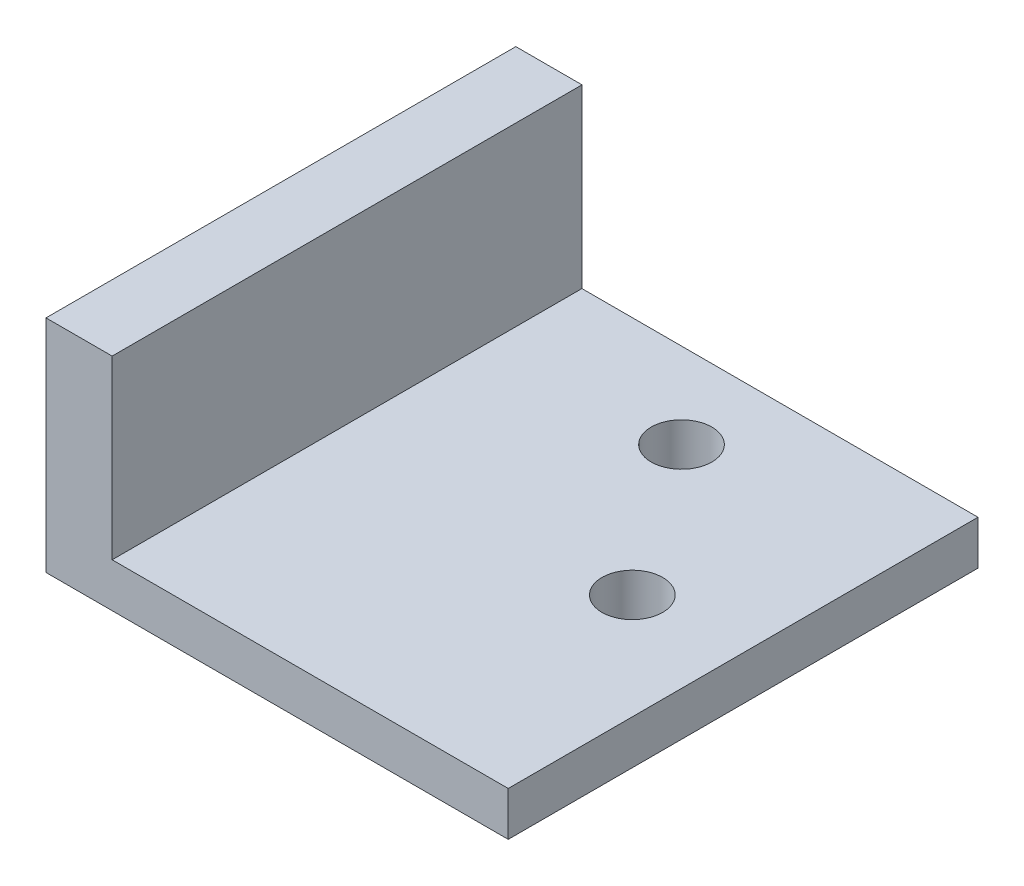
ISO-10303-21;
HEADER;
FILE_DESCRIPTION(('STEP AP214'),'2;1');
FILE_NAME('part.step','',(''),(''),'','','');
FILE_SCHEMA(('AUTOMOTIVE_DESIGN { 1 0 10303 214 1 1 1 1 }'));
ENDSEC;
DATA;
#1=APPLICATION_CONTEXT('core data for automotive mechanical design processes');
#2=APPLICATION_PROTOCOL_DEFINITION('international standard','automotive_design',2000,#1);
#3=PRODUCT_CONTEXT('',#1,'mechanical');
#4=PRODUCT('Part','Part','',(#3));
#5=PRODUCT_RELATED_PRODUCT_CATEGORY('part','',(#4));
#6=PRODUCT_DEFINITION_FORMATION('','',#4);
#7=PRODUCT_DEFINITION_CONTEXT('part definition',#1,'design');
#8=PRODUCT_DEFINITION('design','',#6,#7);
#9=PRODUCT_DEFINITION_SHAPE('','',#8);
#10=(LENGTH_UNIT() NAMED_UNIT(*) SI_UNIT(.MILLI.,.METRE.));
#11=(NAMED_UNIT(*) PLANE_ANGLE_UNIT() SI_UNIT($,.RADIAN.));
#12=(NAMED_UNIT(*) SI_UNIT($,.STERADIAN.) SOLID_ANGLE_UNIT());
#13=UNCERTAINTY_MEASURE_WITH_UNIT(LENGTH_MEASURE(1.E-05),#10,'distance_accuracy_value','');
#14=(GEOMETRIC_REPRESENTATION_CONTEXT(3) GLOBAL_UNCERTAINTY_ASSIGNED_CONTEXT((#13)) GLOBAL_UNIT_ASSIGNED_CONTEXT((#10,
#11,#12)) REPRESENTATION_CONTEXT('',''));
#15=CARTESIAN_POINT('',(0.,0.,0.));
#16=DIRECTION('',(0.,0.,1.));
#17=DIRECTION('',(1.,0.,0.));
#18=AXIS2_PLACEMENT_3D('',#15,#16,#17);
#19=CARTESIAN_POINT('',(0.,2.,0.));
#20=DIRECTION('',(0.,1.,0.));
#21=DIRECTION('',(0.,0.,1.));
#22=AXIS2_PLACEMENT_3D('',#19,#20,#21);
#23=PLANE('',#22);
#24=CARTESIAN_POINT('',(-2.59702508605739,2.,-12.1152087906646));
#25=DIRECTION('',(0.,1.,0.));
#26=DIRECTION('',(0.,0.,1.));
#27=AXIS2_PLACEMENT_3D('',#24,#25,#26);
#28=CIRCLE('',#27,1.375);
#29=CARTESIAN_POINT('',(-2.59702508605739,2.,-10.7402087906646));
#30=VERTEX_POINT('',#29);
#31=EDGE_CURVE('E158',#30,#30,#28,.T.);
#32=ORIENTED_EDGE('',*,*,#31,.F.);
#33=EDGE_LOOP('',(#32));
#34=FACE_BOUND('',#33,.T.);
#35=DIRECTION('',(-1.,0.,0.));
#36=VECTOR('',#35,1.);
#37=CARTESIAN_POINT('',(6.97994089204036,2.,-15.9817188738401));
#38=LINE('',#37,#36);
#39=CARTESIAN_POINT('',(6.97994089204036,2.,-15.9817188738401));
#40=VERTEX_POINT('',#39);
#41=CARTESIAN_POINT('',(-10.9799408920404,2.,-15.9817188738401));
#42=VERTEX_POINT('',#41);
#43=EDGE_CURVE('E170',#40,#42,#38,.T.);
#44=ORIENTED_EDGE('',*,*,#43,.T.);
#45=DIRECTION('',(0.,0.,1.));
#46=VECTOR('',#45,1.);
#47=CARTESIAN_POINT('',(-10.9799408920404,2.,-15.9817188738401));
#48=LINE('',#47,#46);
#49=CARTESIAN_POINT('',(-10.9799408920404,2.,5.32048414468573));
#50=VERTEX_POINT('',#49);
#51=EDGE_CURVE('E137',#42,#50,#48,.T.);
#52=ORIENTED_EDGE('',*,*,#51,.T.);
#53=DIRECTION('',(1.,0.,0.));
#54=VECTOR('',#53,1.);
#55=CARTESIAN_POINT('',(6.97994089204036,2.,5.32048414468573));
#56=LINE('',#55,#54);
#57=CARTESIAN_POINT('',(6.97994089204036,2.,5.32048414468573));
#58=VERTEX_POINT('',#57);
#59=EDGE_CURVE('E79',#50,#58,#56,.T.);
#60=ORIENTED_EDGE('',*,*,#59,.T.);
#61=DIRECTION('',(0.,0.,-1.));
#62=VECTOR('',#61,1.);
#63=CARTESIAN_POINT('',(6.97994089204036,2.,-15.9817188738401));
#64=LINE('',#63,#62);
#65=EDGE_CURVE('E63',#58,#40,#64,.T.);
#66=ORIENTED_EDGE('',*,*,#65,.T.);
#67=EDGE_LOOP('',(#44,#52,#60,#66));
#68=FACE_BOUND('',#67,.T.);
#69=CARTESIAN_POINT('',(2.19329503714343,2.,-5.09361117208399));
#70=DIRECTION('',(0.,1.,0.));
#71=DIRECTION('',(0.,0.,1.));
#72=AXIS2_PLACEMENT_3D('',#69,#70,#71);
#73=CIRCLE('',#72,1.375);
#74=CARTESIAN_POINT('',(2.19329503714343,2.,-3.71861117208399));
#75=VERTEX_POINT('',#74);
#76=EDGE_CURVE('E150',#75,#75,#73,.T.);
#77=ORIENTED_EDGE('',*,*,#76,.F.);
#78=EDGE_LOOP('',(#77));
#79=FACE_BOUND('',#78,.T.);
#80=ADVANCED_FACE('F45',(#34,#68,#79),#23,.T.);
#81=CARTESIAN_POINT('',(0.,0.,0.));
#82=DIRECTION('',(0.,1.,0.));
#83=DIRECTION('',(0.,0.,1.));
#84=AXIS2_PLACEMENT_3D('',#81,#82,#83);
#85=PLANE('',#84);
#86=DIRECTION('',(1.,0.,0.));
#87=VECTOR('',#86,1.);
#88=CARTESIAN_POINT('',(6.97994089204036,0.,5.32048414468573));
#89=LINE('',#88,#87);
#90=CARTESIAN_POINT('',(-13.9799408920404,0.,5.32048414468573));
#91=VERTEX_POINT('',#90);
#92=CARTESIAN_POINT('',(6.97994089204036,0.,5.32048414468573));
#93=VERTEX_POINT('',#92);
#94=EDGE_CURVE('E74',#91,#93,#89,.T.);
#95=ORIENTED_EDGE('',*,*,#94,.F.);
#96=DIRECTION('',(0.,0.,1.));
#97=VECTOR('',#96,1.);
#98=CARTESIAN_POINT('',(-13.9799408920404,0.,5.32048414468573));
#99=LINE('',#98,#97);
#100=CARTESIAN_POINT('',(-13.9799408920404,0.,-15.9845860562872));
#101=VERTEX_POINT('',#100);
#102=EDGE_CURVE('E128',#101,#91,#99,.T.);
#103=ORIENTED_EDGE('',*,*,#102,.F.);
#104=DIRECTION('',(-1.,0.,0.));
#105=VECTOR('',#104,1.);
#106=CARTESIAN_POINT('',(-10.9799408920404,0.,-15.9845860562872));
#107=LINE('',#106,#105);
#108=CARTESIAN_POINT('',(-10.9799408920404,0.,-15.9845860562872));
#109=VERTEX_POINT('',#108);
#110=EDGE_CURVE('E192',#109,#101,#107,.T.);
#111=ORIENTED_EDGE('',*,*,#110,.F.);
#112=DIRECTION('',(0.,0.,-1.));
#113=VECTOR('',#112,1.);
#114=CARTESIAN_POINT('',(-10.9799408920404,0.,5.32048414468573));
#115=LINE('',#114,#113);
#116=CARTESIAN_POINT('',(-10.9799408920404,0.,-15.9817188738401));
#117=VERTEX_POINT('',#116);
#118=EDGE_CURVE('E134',#117,#109,#115,.T.);
#119=ORIENTED_EDGE('',*,*,#118,.F.);
#120=DIRECTION('',(-1.,0.,0.));
#121=VECTOR('',#120,1.);
#122=CARTESIAN_POINT('',(6.97994089204036,0.,-15.9817188738401));
#123=LINE('',#122,#121);
#124=CARTESIAN_POINT('',(6.97994089204036,0.,-15.9817188738401));
#125=VERTEX_POINT('',#124);
#126=EDGE_CURVE('E167',#125,#117,#123,.T.);
#127=ORIENTED_EDGE('',*,*,#126,.F.);
#128=DIRECTION('',(0.,0.,-1.));
#129=VECTOR('',#128,1.);
#130=CARTESIAN_POINT('',(6.97994089204036,0.,-15.9817188738401));
#131=LINE('',#130,#129);
#132=EDGE_CURVE('E175',#93,#125,#131,.T.);
#133=ORIENTED_EDGE('',*,*,#132,.F.);
#134=EDGE_LOOP('',(#95,#103,#111,#119,#127,#133));
#135=FACE_BOUND('',#134,.T.);
#136=CARTESIAN_POINT('',(-2.59702508605739,0.,-12.1152087906646));
#137=DIRECTION('',(0.,1.,0.));
#138=DIRECTION('',(0.,0.,1.));
#139=AXIS2_PLACEMENT_3D('',#136,#137,#138);
#140=CIRCLE('',#139,1.375);
#141=CARTESIAN_POINT('',(-2.59702508605739,0.,-10.7402087906646));
#142=VERTEX_POINT('',#141);
#143=EDGE_CURVE('E154',#142,#142,#140,.T.);
#144=ORIENTED_EDGE('',*,*,#143,.T.);
#145=EDGE_LOOP('',(#144));
#146=FACE_BOUND('',#145,.T.);
#147=CARTESIAN_POINT('',(2.19329503714343,0.,-5.09361117208399));
#148=DIRECTION('',(0.,1.,0.));
#149=DIRECTION('',(0.,0.,1.));
#150=AXIS2_PLACEMENT_3D('',#147,#148,#149);
#151=CIRCLE('',#150,1.375);
#152=CARTESIAN_POINT('',(2.19329503714343,0.,-3.71861117208399));
#153=VERTEX_POINT('',#152);
#154=EDGE_CURVE('E149',#153,#153,#151,.T.);
#155=ORIENTED_EDGE('',*,*,#154,.T.);
#156=EDGE_LOOP('',(#155));
#157=FACE_BOUND('',#156,.T.);
#158=ADVANCED_FACE('F189',(#135,#146,#157),#85,.F.);
#159=CARTESIAN_POINT('',(6.97994089204036,2.,5.32048414468573));
#160=DIRECTION('',(0.,0.,-1.));
#161=DIRECTION('',(-1.,0.,0.));
#162=AXIS2_PLACEMENT_3D('',#159,#160,#161);
#163=PLANE('',#162);
#164=ORIENTED_EDGE('',*,*,#94,.T.);
#165=DIRECTION('',(0.,-1.,0.));
#166=VECTOR('',#165,1.);
#167=CARTESIAN_POINT('',(6.97994089204036,2.,5.32048414468573));
#168=LINE('',#167,#166);
#169=EDGE_CURVE('E11',#58,#93,#168,.T.);
#170=ORIENTED_EDGE('',*,*,#169,.F.);
#171=ORIENTED_EDGE('',*,*,#59,.F.);
#172=DIRECTION('',(0.,-1.,0.));
#173=VECTOR('',#172,1.);
#174=CARTESIAN_POINT('',(-10.9799408920404,10.,5.32048414468573));
#175=LINE('',#174,#173);
#176=CARTESIAN_POINT('',(-10.9799408920404,10.,5.32048414468573));
#177=VERTEX_POINT('',#176);
#178=EDGE_CURVE('E203',#177,#50,#175,.T.);
#179=ORIENTED_EDGE('',*,*,#178,.F.);
#180=DIRECTION('',(1.,0.,0.));
#181=VECTOR('',#180,1.);
#182=CARTESIAN_POINT('',(-10.9799408920404,10.,5.32048414468573));
#183=LINE('',#182,#181);
#184=CARTESIAN_POINT('',(-13.9799408920404,10.,5.32048414468573));
#185=VERTEX_POINT('',#184);
#186=EDGE_CURVE('E124',#185,#177,#183,.T.);
#187=ORIENTED_EDGE('',*,*,#186,.F.);
#188=DIRECTION('',(0.,-1.,0.));
#189=VECTOR('',#188,1.);
#190=CARTESIAN_POINT('',(-13.9799408920404,10.,5.32048414468573));
#191=LINE('',#190,#189);
#192=EDGE_CURVE('E143',#185,#91,#191,.T.);
#193=ORIENTED_EDGE('',*,*,#192,.T.);
#194=EDGE_LOOP('',(#164,#170,#171,#179,#187,#193));
#195=FACE_BOUND('',#194,.T.);
#196=ADVANCED_FACE('F47',(#195),#163,.F.);
#197=CARTESIAN_POINT('',(6.97994089204036,2.,-15.9817188738401));
#198=DIRECTION('',(-1.,0.,0.));
#199=DIRECTION('',(0.,0.,1.));
#200=AXIS2_PLACEMENT_3D('',#197,#198,#199);
#201=PLANE('',#200);
#202=ORIENTED_EDGE('',*,*,#132,.T.);
#203=DIRECTION('',(0.,-1.,0.));
#204=VECTOR('',#203,1.);
#205=CARTESIAN_POINT('',(6.97994089204036,2.,-15.9817188738401));
#206=LINE('',#205,#204);
#207=EDGE_CURVE('E55',#40,#125,#206,.T.);
#208=ORIENTED_EDGE('',*,*,#207,.F.);
#209=ORIENTED_EDGE('',*,*,#65,.F.);
#210=ORIENTED_EDGE('',*,*,#169,.T.);
#211=EDGE_LOOP('',(#202,#208,#209,#210));
#212=FACE_BOUND('',#211,.T.);
#213=ADVANCED_FACE('F233',(#212),#201,.F.);
#214=CARTESIAN_POINT('',(6.97994089204036,2.,-15.9817188738401));
#215=DIRECTION('',(0.,0.,1.));
#216=DIRECTION('',(1.,0.,0.));
#217=AXIS2_PLACEMENT_3D('',#214,#215,#216);
#218=PLANE('',#217);
#219=ORIENTED_EDGE('',*,*,#126,.T.);
#220=DIRECTION('',(0.,-1.,0.));
#221=VECTOR('',#220,1.);
#222=CARTESIAN_POINT('',(-10.9799408920404,2.,-15.9817188738401));
#223=LINE('',#222,#221);
#224=EDGE_CURVE('E141',#42,#117,#223,.T.);
#225=ORIENTED_EDGE('',*,*,#224,.F.);
#226=ORIENTED_EDGE('',*,*,#43,.F.);
#227=ORIENTED_EDGE('',*,*,#207,.T.);
#228=EDGE_LOOP('',(#219,#225,#226,#227));
#229=FACE_BOUND('',#228,.T.);
#230=ADVANCED_FACE('F184',(#229),#218,.F.);
#231=CARTESIAN_POINT('',(-2.59702508605739,2.,-12.1152087906646));
#232=DIRECTION('',(0.,-1.,0.));
#233=DIRECTION('',(0.,0.,-1.));
#234=AXIS2_PLACEMENT_3D('',#231,#232,#233);
#235=CYLINDRICAL_SURFACE('',#234,1.375);
#236=ORIENTED_EDGE('',*,*,#31,.T.);
#237=EDGE_LOOP('',(#236));
#238=FACE_BOUND('',#237,.T.);
#239=ORIENTED_EDGE('',*,*,#143,.F.);
#240=EDGE_LOOP('',(#239));
#241=FACE_BOUND('',#240,.T.);
#242=ADVANCED_FACE('F229',(#238,#241),#235,.F.);
#243=CARTESIAN_POINT('',(2.19329503714343,2.,-5.09361117208399));
#244=DIRECTION('',(0.,-1.,0.));
#245=DIRECTION('',(0.,0.,-1.));
#246=AXIS2_PLACEMENT_3D('',#243,#244,#245);
#247=CYLINDRICAL_SURFACE('',#246,1.375);
#248=ORIENTED_EDGE('',*,*,#76,.T.);
#249=EDGE_LOOP('',(#248));
#250=FACE_BOUND('',#249,.T.);
#251=ORIENTED_EDGE('',*,*,#154,.F.);
#252=EDGE_LOOP('',(#251));
#253=FACE_BOUND('',#252,.T.);
#254=ADVANCED_FACE('F254',(#250,#253),#247,.F.);
#255=CARTESIAN_POINT('',(-10.9799408920404,10.,5.32048414468573));
#256=DIRECTION('',(-1.,0.,0.));
#257=DIRECTION('',(0.,0.,1.));
#258=AXIS2_PLACEMENT_3D('',#255,#256,#257);
#259=PLANE('',#258);
#260=ORIENTED_EDGE('',*,*,#51,.F.);
#261=ORIENTED_EDGE('',*,*,#224,.T.);
#262=ORIENTED_EDGE('',*,*,#118,.T.);
#263=DIRECTION('',(0.,-1.,0.));
#264=VECTOR('',#263,1.);
#265=CARTESIAN_POINT('',(-10.9799408920404,10.,-15.9845860562872));
#266=LINE('',#265,#264);
#267=CARTESIAN_POINT('',(-10.9799408920404,10.,-15.9845860562872));
#268=VERTEX_POINT('',#267);
#269=EDGE_CURVE('E112',#268,#109,#266,.T.);
#270=ORIENTED_EDGE('',*,*,#269,.F.);
#271=DIRECTION('',(0.,0.,-1.));
#272=VECTOR('',#271,1.);
#273=CARTESIAN_POINT('',(-10.9799408920404,10.,5.32048414468573));
#274=LINE('',#273,#272);
#275=EDGE_CURVE('E119',#177,#268,#274,.T.);
#276=ORIENTED_EDGE('',*,*,#275,.F.);
#277=ORIENTED_EDGE('',*,*,#178,.T.);
#278=EDGE_LOOP('',(#260,#261,#262,#270,#276,#277));
#279=FACE_BOUND('',#278,.T.);
#280=ADVANCED_FACE('F131',(#279),#259,.F.);
#281=CARTESIAN_POINT('',(-10.9799408920404,10.,-15.9845860562872));
#282=DIRECTION('',(0.,0.,1.));
#283=DIRECTION('',(1.,0.,0.));
#284=AXIS2_PLACEMENT_3D('',#281,#282,#283);
#285=PLANE('',#284);
#286=ORIENTED_EDGE('',*,*,#110,.T.);
#287=DIRECTION('',(0.,-1.,0.));
#288=VECTOR('',#287,1.);
#289=CARTESIAN_POINT('',(-13.9799408920404,10.,-15.9845860562872));
#290=LINE('',#289,#288);
#291=CARTESIAN_POINT('',(-13.9799408920404,10.,-15.9845860562872));
#292=VERTEX_POINT('',#291);
#293=EDGE_CURVE('E114',#292,#101,#290,.T.);
#294=ORIENTED_EDGE('',*,*,#293,.F.);
#295=DIRECTION('',(-1.,0.,0.));
#296=VECTOR('',#295,1.);
#297=CARTESIAN_POINT('',(-10.9799408920404,10.,-15.9845860562872));
#298=LINE('',#297,#296);
#299=EDGE_CURVE('E108',#268,#292,#298,.T.);
#300=ORIENTED_EDGE('',*,*,#299,.F.);
#301=ORIENTED_EDGE('',*,*,#269,.T.);
#302=EDGE_LOOP('',(#286,#294,#300,#301));
#303=FACE_BOUND('',#302,.T.);
#304=ADVANCED_FACE('F110',(#303),#285,.F.);
#305=CARTESIAN_POINT('',(-13.9799408920404,10.,5.32048414468573));
#306=DIRECTION('',(1.,0.,0.));
#307=DIRECTION('',(0.,0.,-1.));
#308=AXIS2_PLACEMENT_3D('',#305,#306,#307);
#309=PLANE('',#308);
#310=ORIENTED_EDGE('',*,*,#102,.T.);
#311=ORIENTED_EDGE('',*,*,#192,.F.);
#312=DIRECTION('',(0.,0.,1.));
#313=VECTOR('',#312,1.);
#314=CARTESIAN_POINT('',(-13.9799408920404,10.,5.32048414468573));
#315=LINE('',#314,#313);
#316=EDGE_CURVE('E118',#292,#185,#315,.T.);
#317=ORIENTED_EDGE('',*,*,#316,.F.);
#318=ORIENTED_EDGE('',*,*,#293,.T.);
#319=EDGE_LOOP('',(#310,#311,#317,#318));
#320=FACE_BOUND('',#319,.T.);
#321=ADVANCED_FACE('F208',(#320),#309,.F.);
#322=CARTESIAN_POINT('',(0.,10.,0.));
#323=DIRECTION('',(0.,1.,0.));
#324=DIRECTION('',(0.,0.,1.));
#325=AXIS2_PLACEMENT_3D('',#322,#323,#324);
#326=PLANE('',#325);
#327=ORIENTED_EDGE('',*,*,#275,.T.);
#328=ORIENTED_EDGE('',*,*,#299,.T.);
#329=ORIENTED_EDGE('',*,*,#316,.T.);
#330=ORIENTED_EDGE('',*,*,#186,.T.);
#331=EDGE_LOOP('',(#327,#328,#329,#330));
#332=FACE_BOUND('',#331,.T.);
#333=ADVANCED_FACE('F122',(#332),#326,.T.);
#334=CLOSED_SHELL('',(#80,#158,#196,#213,#230,#242,#254,#280,#304,#321,#333));
#335=MANIFOLD_SOLID_BREP('B2',#334);
#336=ADVANCED_BREP_SHAPE_REPRESENTATION('',(#18,#335),#14);
#337=SHAPE_DEFINITION_REPRESENTATION(#9,#336);
ENDSEC;
END-ISO-10303-21;
